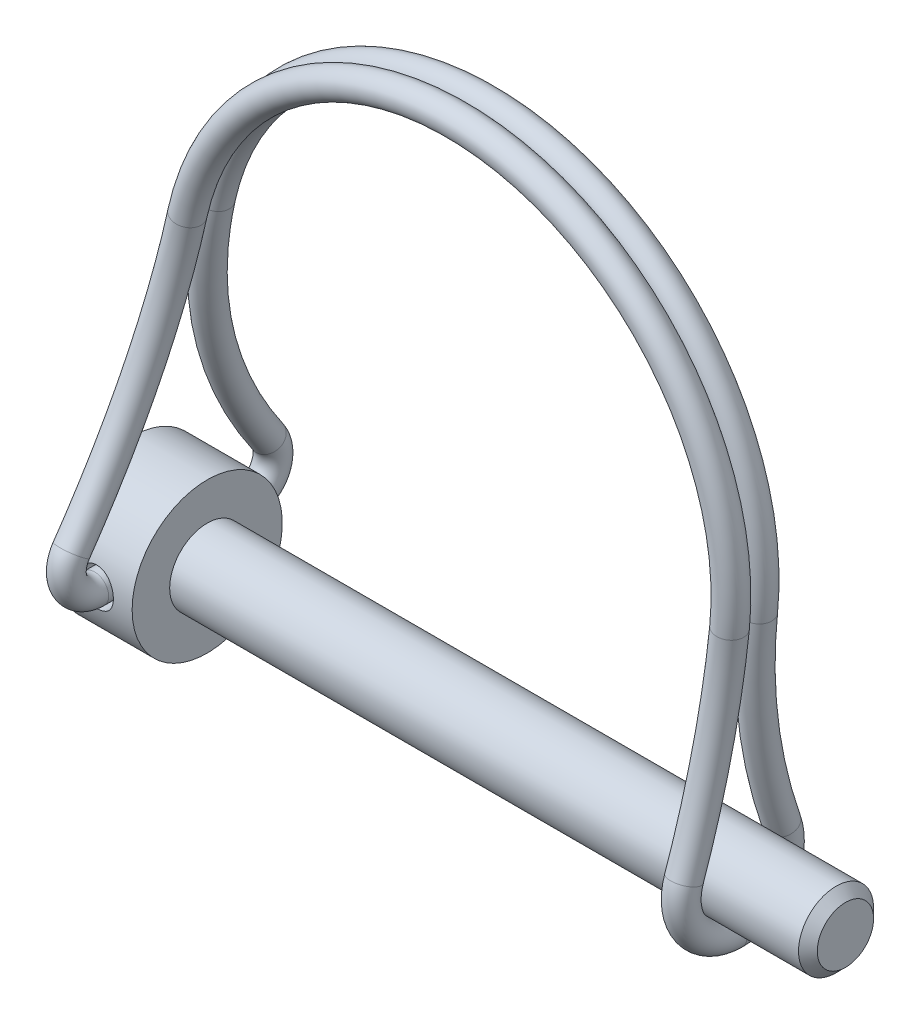
ISO-10303-21;
HEADER;
FILE_DESCRIPTION(('STEP AP214'),'2;1');
FILE_NAME('part.step','',(''),(''),'','','');
FILE_SCHEMA(('AUTOMOTIVE_DESIGN { 1 0 10303 214 1 1 1 1 }'));
ENDSEC;
DATA;
#1=APPLICATION_CONTEXT('core data for automotive mechanical design processes');
#2=APPLICATION_PROTOCOL_DEFINITION('international standard','automotive_design',2000,#1);
#3=PRODUCT_CONTEXT('',#1,'mechanical');
#4=PRODUCT('Part','Part','',(#3));
#5=PRODUCT_RELATED_PRODUCT_CATEGORY('part','',(#4));
#6=PRODUCT_DEFINITION_FORMATION('','',#4);
#7=PRODUCT_DEFINITION_CONTEXT('part definition',#1,'design');
#8=PRODUCT_DEFINITION('design','',#6,#7);
#9=PRODUCT_DEFINITION_SHAPE('','',#8);
#10=(LENGTH_UNIT() NAMED_UNIT(*) SI_UNIT(.MILLI.,.METRE.));
#11=(NAMED_UNIT(*) PLANE_ANGLE_UNIT() SI_UNIT($,.RADIAN.));
#12=(NAMED_UNIT(*) SI_UNIT($,.STERADIAN.) SOLID_ANGLE_UNIT());
#13=UNCERTAINTY_MEASURE_WITH_UNIT(LENGTH_MEASURE(1.E-05),#10,'distance_accuracy_value','');
#14=(GEOMETRIC_REPRESENTATION_CONTEXT(3) GLOBAL_UNCERTAINTY_ASSIGNED_CONTEXT((#13)) GLOBAL_UNIT_ASSIGNED_CONTEXT((#10,
#11,#12)) REPRESENTATION_CONTEXT('',''));
#15=CARTESIAN_POINT('',(0.,0.,0.));
#16=DIRECTION('',(0.,0.,1.));
#17=DIRECTION('',(1.,0.,0.));
#18=AXIS2_PLACEMENT_3D('',#15,#16,#17);
#19=CARTESIAN_POINT('',(50.8,0.,0.));
#20=DIRECTION('',(1.,0.,0.));
#21=DIRECTION('',(0.,0.,1.));
#22=AXIS2_PLACEMENT_3D('',#19,#20,#21);
#23=TOROIDAL_SURFACE('',#22,4.36562499999999,1.190625);
#24=CARTESIAN_POINT('',(50.8,-4.36562499999999,0.));
#25=DIRECTION('',(0.,0.,-1.));
#26=DIRECTION('',(-0.996347455698327,-0.0853917298306528,0.));
#27=AXIS2_PLACEMENT_3D('',#24,#25,#26);
#28=CIRCLE('',#27,1.190625);
#29=CARTESIAN_POINT('',(50.8,-5.55624999999999,0.));
#30=VERTEX_POINT('',#29);
#31=EDGE_CURVE('E11',#30,#30,#28,.T.);
#32=CARTESIAN_POINT('',(50.8,1.43033233820924,-4.12466132462991));
#33=DIRECTION('',(0.,0.944804312012578,0.327635181264832));
#34=DIRECTION('',(-0.996347455698327,0.0279773348815834,-0.0806784745542138));
#35=AXIS2_PLACEMENT_3D('',#32,#33,#34);
#36=CIRCLE('',#35,1.190625);
#37=CARTESIAN_POINT('',(50.8,1.82042297590267,-5.24956895861989));
#38=VERTEX_POINT('',#37);
#39=EDGE_CURVE('E48',#38,#38,#36,.T.);
#40=CARTESIAN_POINT('',(50.8,0.,0.));
#41=DIRECTION('',(1.,0.,0.));
#42=DIRECTION('',(0.,0.,1.));
#43=AXIS2_PLACEMENT_3D('',#40,#41,#42);
#44=CIRCLE('',#43,5.55624999999999);
#45=EDGE_CURVE('',#30,#38,#44,.T.);
#46=ORIENTED_EDGE('',*,*,#31,.T.);
#47=ORIENTED_EDGE('',*,*,#39,.F.);
#48=ORIENTED_EDGE('',*,*,#45,.T.);
#49=ORIENTED_EDGE('',*,*,#45,.F.);
#50=EDGE_LOOP('',(#46,#48,#47,#49));
#51=FACE_BOUND('',#50,.T.);
#52=ADVANCED_FACE('F42',(#51),#23,.T.);
#53=CARTESIAN_POINT('',(66.0000324491605,17.3339810536363,-49.9861461171416));
#54=DIRECTION('',(-0.95430598947787,0.0979076101876663,-0.282336994235618));
#55=DIRECTION('',(0.283700028650479,0.,-0.958913079347507));
#56=AXIS2_PLACEMENT_3D('',#53,#54,#55);
#57=TOROIDAL_SURFACE('',#56,50.8649468326962,1.190625);
#58=CARTESIAN_POINT('',(51.7139660018043,18.7996688312098,-1.19062499999999));
#59=DIRECTION('',(0.102059887315406,0.994778256397458,0.));
#60=DIRECTION('',(-0.992461773581279,0.101822226335518,-0.0682045614602101));
#61=AXIS2_PLACEMENT_3D('',#58,#59,#60);
#62=CIRCLE('',#61,1.190625);
#63=CARTESIAN_POINT('',(52.8983738633275,18.6781537778749,-1.19062499999999));
#64=VERTEX_POINT('',#63);
#65=EDGE_CURVE('E52',#64,#64,#62,.T.);
#66=ORIENTED_EDGE('',*,*,#65,.F.);
#67=EDGE_LOOP('',(#66));
#68=FACE_BOUND('',#67,.T.);
#69=ORIENTED_EDGE('',*,*,#39,.T.);
#70=EDGE_LOOP('',(#69));
#71=FACE_BOUND('',#70,.T.);
#72=ADVANCED_FACE('F89',(#68,#71),#57,.T.);
#73=CARTESIAN_POINT('',(28.575,21.1736252858788,-1.19062499999999));
#74=DIRECTION('',(0.,0.,1.));
#75=DIRECTION('',(-1.,0.,0.));
#76=AXIS2_PLACEMENT_3D('',#73,#74,#75);
#77=TOROIDAL_SURFACE('',#76,23.2604259823701,1.190625);
#78=CARTESIAN_POINT('',(5.85964491433834,26.1796277043385,-1.19062499999999));
#79=DIRECTION('',(-0.215215423064648,-0.976566598689052,0.));
#80=DIRECTION('',(0.974292524311,-0.214714263307587,-0.0682045614602101));
#81=AXIS2_PLACEMENT_3D('',#78,#79,#80);
#82=CIRCLE('',#81,1.190625);
#83=CARTESIAN_POINT('',(4.6969203077742,26.4358685674249,-1.19062499999999));
#84=VERTEX_POINT('',#83);
#85=EDGE_CURVE('E56',#84,#84,#82,.T.);
#86=CARTESIAN_POINT('',(28.575,21.1736252858788,-1.19062499999999));
#87=DIRECTION('',(0.,0.,1.));
#88=DIRECTION('',(-1.,0.,0.));
#89=AXIS2_PLACEMENT_3D('',#86,#87,#88);
#90=CIRCLE('',#89,24.4510509823701);
#91=EDGE_CURVE('',#64,#84,#90,.T.);
#92=ORIENTED_EDGE('',*,*,#65,.T.);
#93=ORIENTED_EDGE('',*,*,#85,.F.);
#94=ORIENTED_EDGE('',*,*,#91,.T.);
#95=ORIENTED_EDGE('',*,*,#91,.F.);
#96=EDGE_LOOP('',(#92,#94,#93,#95));
#97=FACE_BOUND('',#96,.T.);
#98=ADVANCED_FACE('F83',(#97),#77,.T.);
#99=CARTESIAN_POINT('',(16.7146795796366,23.7873987657186,-37.1127792874404));
#100=DIRECTION('',(0.932924154510997,-0.205597515694107,0.29560477579084));
#101=DIRECTION('',(-0.302057745950095,0.,0.953289629709433));
#102=AXIS2_PLACEMENT_3D('',#99,#100,#101);
#103=TOROIDAL_SURFACE('',#102,37.6026023770998,1.190625);
#104=CARTESIAN_POINT('',(3.175,3.75690670294242,-8.31326244888729));
#105=DIRECTION('',(0.,-0.820958042578213,-0.570988522061651));
#106=DIRECTION('',(1.,0.,0.));
#107=AXIS2_PLACEMENT_3D('',#104,#105,#106);
#108=CIRCLE('',#107,1.190625);
#109=CARTESIAN_POINT('',(3.175,4.43673991202207,-9.29071561833197));
#110=VERTEX_POINT('',#109);
#111=EDGE_CURVE('E61',#110,#110,#108,.T.);
#112=ORIENTED_EDGE('',*,*,#111,.F.);
#113=EDGE_LOOP('',(#112));
#114=FACE_BOUND('',#113,.T.);
#115=ORIENTED_EDGE('',*,*,#85,.T.);
#116=EDGE_LOOP('',(#115));
#117=FACE_BOUND('',#116,.T.);
#118=ADVANCED_FACE('F77',(#114,#117),#103,.T.);
#119=CARTESIAN_POINT('',(3.175,2.39142848606693,-6.35));
#120=DIRECTION('',(-1.,0.,0.));
#121=DIRECTION('',(0.,0.,-1.));
#122=AXIS2_PLACEMENT_3D('',#119,#120,#121);
#123=TOROIDAL_SURFACE('',#122,2.39142848606693,1.190625);
#124=CARTESIAN_POINT('',(3.175,0.,-6.35));
#125=DIRECTION('',(0.,0.,1.));
#126=DIRECTION('',(1.,0.,0.));
#127=AXIS2_PLACEMENT_3D('',#124,#125,#126);
#128=CIRCLE('',#127,1.190625);
#129=CARTESIAN_POINT('',(3.175,-1.190625,-6.35));
#130=VERTEX_POINT('',#129);
#131=EDGE_CURVE('E64',#130,#130,#128,.T.);
#132=CARTESIAN_POINT('',(3.175,2.39142848606693,-6.35));
#133=DIRECTION('',(-1.,0.,0.));
#134=DIRECTION('',(0.,0.,-1.));
#135=AXIS2_PLACEMENT_3D('',#132,#133,#134);
#136=CIRCLE('',#135,3.58205348606693);
#137=EDGE_CURVE('',#110,#130,#136,.T.);
#138=ORIENTED_EDGE('',*,*,#111,.T.);
#139=ORIENTED_EDGE('',*,*,#131,.F.);
#140=ORIENTED_EDGE('',*,*,#137,.T.);
#141=ORIENTED_EDGE('',*,*,#137,.F.);
#142=EDGE_LOOP('',(#138,#140,#139,#141));
#143=FACE_BOUND('',#142,.T.);
#144=ADVANCED_FACE('F74',(#143),#123,.T.);
#145=CARTESIAN_POINT('',(3.175,0.,-6.35));
#146=DIRECTION('',(0.,0.,1.));
#147=DIRECTION('',(0.,1.,0.));
#148=AXIS2_PLACEMENT_3D('',#145,#146,#147);
#149=CYLINDRICAL_SURFACE('',#148,1.190625);
#150=ORIENTED_EDGE('',*,*,#131,.T.);
#151=EDGE_LOOP('',(#150));
#152=FACE_BOUND('',#151,.T.);
#153=CARTESIAN_POINT('',(3.175,0.,0.));
#154=DIRECTION('',(0.,0.,1.));
#155=DIRECTION('',(1.,0.,0.));
#156=AXIS2_PLACEMENT_3D('',#153,#154,#155);
#157=CIRCLE('',#156,1.190625);
#158=CARTESIAN_POINT('',(4.365625,0.,0.));
#159=VERTEX_POINT('',#158);
#160=EDGE_CURVE('E65',#159,#159,#157,.T.);
#161=ORIENTED_EDGE('',*,*,#160,.F.);
#162=EDGE_LOOP('',(#161));
#163=FACE_BOUND('',#162,.T.);
#164=ADVANCED_FACE('F71',(#152,#163),#149,.T.);
#165=CARTESIAN_POINT('',(50.8,-4.36562499999998,0.));
#166=DIRECTION('',(0.,0.,1.));
#167=DIRECTION('',(-0.996347455698327,-0.0853917298306528,0.));
#168=AXIS2_PLACEMENT_3D('',#165,#166,#167);
#169=PLANE('',#168);
#170=ORIENTED_EDGE('',*,*,#31,.F.);
#171=EDGE_LOOP('',(#170));
#172=FACE_BOUND('',#171,.T.);
#173=ADVANCED_FACE('F101',(#172),#169,.T.);
#174=CARTESIAN_POINT('',(3.175,0.,0.));
#175=DIRECTION('',(0.,0.,-1.));
#176=DIRECTION('',(1.,0.,0.));
#177=AXIS2_PLACEMENT_3D('',#174,#175,#176);
#178=PLANE('',#177);
#179=ORIENTED_EDGE('',*,*,#160,.T.);
#180=EDGE_LOOP('',(#179));
#181=FACE_BOUND('',#180,.T.);
#182=ADVANCED_FACE('F102',(#181),#178,.F.);
#183=CLOSED_SHELL('',(#52,#72,#98,#118,#144,#164,#173,#182));
#184=MANIFOLD_SOLID_BREP('B2',#183);
#185=CARTESIAN_POINT('',(50.8,0.,0.));
#186=DIRECTION('',(1.,0.,0.));
#187=DIRECTION('',(0.,0.,-1.));
#188=AXIS2_PLACEMENT_3D('',#185,#186,#187);
#189=TOROIDAL_SURFACE('',#188,4.36562499999999,1.190625);
#190=CARTESIAN_POINT('',(50.8,1.43033233820924,4.12466132462991));
#191=DIRECTION('',(0.,-0.944804312012578,0.327635181264832));
#192=DIRECTION('',(-0.996347455698327,0.0279773348815834,0.0806784745542138));
#193=AXIS2_PLACEMENT_3D('',#190,#191,#192);
#194=CIRCLE('',#193,1.190625);
#195=CARTESIAN_POINT('',(50.8,1.82042297590267,5.24956895861989));
#196=VERTEX_POINT('',#195);
#197=EDGE_CURVE('E171',#196,#196,#194,.T.);
#198=CARTESIAN_POINT('',(50.8,-4.36562499999999,0.));
#199=DIRECTION('',(0.,0.,-1.));
#200=DIRECTION('',(-0.996347455698327,-0.0853917298306528,0.));
#201=AXIS2_PLACEMENT_3D('',#198,#199,#200);
#202=CIRCLE('',#201,1.190625);
#203=CARTESIAN_POINT('',(50.8,-5.55624999999999,0.));
#204=VERTEX_POINT('',#203);
#205=EDGE_CURVE('E41',#204,#204,#202,.T.);
#206=CARTESIAN_POINT('',(50.8,0.,0.));
#207=DIRECTION('',(1.,0.,0.));
#208=DIRECTION('',(0.,0.,-1.));
#209=AXIS2_PLACEMENT_3D('',#206,#207,#208);
#210=CIRCLE('',#209,5.55624999999999);
#211=EDGE_CURVE('',#196,#204,#210,.T.);
#212=ORIENTED_EDGE('',*,*,#197,.T.);
#213=ORIENTED_EDGE('',*,*,#205,.F.);
#214=ORIENTED_EDGE('',*,*,#211,.T.);
#215=ORIENTED_EDGE('',*,*,#211,.F.);
#216=EDGE_LOOP('',(#212,#214,#213,#215));
#217=FACE_BOUND('',#216,.T.);
#218=ADVANCED_FACE('F165',(#217),#189,.T.);
#219=CARTESIAN_POINT('',(66.0000324491605,17.3339810536363,49.9861461171416));
#220=DIRECTION('',(-0.95430598947787,0.0979076101876663,0.282336994235618));
#221=DIRECTION('',(0.283700028650479,0.,0.958913079347507));
#222=AXIS2_PLACEMENT_3D('',#219,#220,#221);
#223=TOROIDAL_SURFACE('',#222,50.8649468326962,1.190625);
#224=CARTESIAN_POINT('',(51.7139660018043,18.7996688312098,1.19062499999999));
#225=DIRECTION('',(-0.102059887315406,-0.994778256397458,0.));
#226=DIRECTION('',(-0.992461773581279,0.101822226335518,0.0682045614602101));
#227=AXIS2_PLACEMENT_3D('',#224,#225,#226);
#228=CIRCLE('',#227,1.190625);
#229=CARTESIAN_POINT('',(52.8983738633275,18.6781537778749,1.19062499999999));
#230=VERTEX_POINT('',#229);
#231=EDGE_CURVE('E175',#230,#230,#228,.T.);
#232=ORIENTED_EDGE('',*,*,#231,.T.);
#233=EDGE_LOOP('',(#232));
#234=FACE_BOUND('',#233,.T.);
#235=ORIENTED_EDGE('',*,*,#197,.F.);
#236=EDGE_LOOP('',(#235));
#237=FACE_BOUND('',#236,.T.);
#238=ADVANCED_FACE('F212',(#234,#237),#223,.T.);
#239=CARTESIAN_POINT('',(28.575,21.1736252858788,1.19062499999999));
#240=DIRECTION('',(0.,0.,-1.));
#241=DIRECTION('',(-1.,0.,0.));
#242=AXIS2_PLACEMENT_3D('',#239,#240,#241);
#243=TOROIDAL_SURFACE('',#242,23.2604259823701,1.190625);
#244=CARTESIAN_POINT('',(5.85964491433834,26.1796277043385,1.19062499999999));
#245=DIRECTION('',(0.215215423064648,0.976566598689052,0.));
#246=DIRECTION('',(0.974292524311,-0.214714263307587,0.0682045614602101));
#247=AXIS2_PLACEMENT_3D('',#244,#245,#246);
#248=CIRCLE('',#247,1.190625);
#249=CARTESIAN_POINT('',(4.6969203077742,26.4358685674249,1.19062499999999));
#250=VERTEX_POINT('',#249);
#251=EDGE_CURVE('E179',#250,#250,#248,.T.);
#252=CARTESIAN_POINT('',(28.575,21.1736252858788,1.19062499999999));
#253=DIRECTION('',(0.,0.,-1.));
#254=DIRECTION('',(-1.,0.,0.));
#255=AXIS2_PLACEMENT_3D('',#252,#253,#254);
#256=CIRCLE('',#255,24.4510509823701);
#257=EDGE_CURVE('',#250,#230,#256,.T.);
#258=ORIENTED_EDGE('',*,*,#251,.T.);
#259=ORIENTED_EDGE('',*,*,#231,.F.);
#260=ORIENTED_EDGE('',*,*,#257,.T.);
#261=ORIENTED_EDGE('',*,*,#257,.F.);
#262=EDGE_LOOP('',(#258,#260,#259,#261));
#263=FACE_BOUND('',#262,.T.);
#264=ADVANCED_FACE('F216',(#263),#243,.T.);
#265=CARTESIAN_POINT('',(16.7146795796366,23.7873987657186,37.1127792874404));
#266=DIRECTION('',(0.932924154510997,-0.205597515694107,-0.29560477579084));
#267=DIRECTION('',(-0.302057745950095,0.,-0.953289629709433));
#268=AXIS2_PLACEMENT_3D('',#265,#266,#267);
#269=TOROIDAL_SURFACE('',#268,37.6026023770998,1.190625);
#270=CARTESIAN_POINT('',(3.175,3.75690670294242,8.31326244888729));
#271=DIRECTION('',(0.,0.820958042578213,-0.570988522061651));
#272=DIRECTION('',(1.,0.,0.));
#273=AXIS2_PLACEMENT_3D('',#270,#271,#272);
#274=CIRCLE('',#273,1.190625);
#275=CARTESIAN_POINT('',(3.175,4.43673991202207,9.29071561833197));
#276=VERTEX_POINT('',#275);
#277=EDGE_CURVE('E184',#276,#276,#274,.T.);
#278=ORIENTED_EDGE('',*,*,#277,.T.);
#279=EDGE_LOOP('',(#278));
#280=FACE_BOUND('',#279,.T.);
#281=ORIENTED_EDGE('',*,*,#251,.F.);
#282=EDGE_LOOP('',(#281));
#283=FACE_BOUND('',#282,.T.);
#284=ADVANCED_FACE('F222',(#280,#283),#269,.T.);
#285=CARTESIAN_POINT('',(3.175,2.39142848606693,6.35));
#286=DIRECTION('',(-1.,0.,0.));
#287=DIRECTION('',(0.,0.,1.));
#288=AXIS2_PLACEMENT_3D('',#285,#286,#287);
#289=TOROIDAL_SURFACE('',#288,2.39142848606693,1.190625);
#290=CARTESIAN_POINT('',(3.175,0.,6.35));
#291=DIRECTION('',(0.,0.,1.));
#292=DIRECTION('',(1.,0.,0.));
#293=AXIS2_PLACEMENT_3D('',#290,#291,#292);
#294=CIRCLE('',#293,1.190625);
#295=CARTESIAN_POINT('',(3.175,-1.190625,6.35));
#296=VERTEX_POINT('',#295);
#297=EDGE_CURVE('E187',#296,#296,#294,.T.);
#298=CARTESIAN_POINT('',(3.175,2.39142848606693,6.35));
#299=DIRECTION('',(-1.,0.,0.));
#300=DIRECTION('',(0.,0.,1.));
#301=AXIS2_PLACEMENT_3D('',#298,#299,#300);
#302=CIRCLE('',#301,3.58205348606693);
#303=EDGE_CURVE('',#296,#276,#302,.T.);
#304=ORIENTED_EDGE('',*,*,#297,.T.);
#305=ORIENTED_EDGE('',*,*,#277,.F.);
#306=ORIENTED_EDGE('',*,*,#303,.T.);
#307=ORIENTED_EDGE('',*,*,#303,.F.);
#308=EDGE_LOOP('',(#304,#306,#305,#307));
#309=FACE_BOUND('',#308,.T.);
#310=ADVANCED_FACE('F194',(#309),#289,.T.);
#311=CARTESIAN_POINT('',(3.175,0.,6.35));
#312=DIRECTION('',(0.,0.,-1.));
#313=DIRECTION('',(0.,1.,0.));
#314=AXIS2_PLACEMENT_3D('',#311,#312,#313);
#315=CYLINDRICAL_SURFACE('',#314,1.190625);
#316=ORIENTED_EDGE('',*,*,#297,.F.);
#317=EDGE_LOOP('',(#316));
#318=FACE_BOUND('',#317,.T.);
#319=CARTESIAN_POINT('',(3.175,0.,0.));
#320=DIRECTION('',(0.,0.,1.));
#321=DIRECTION('',(1.,0.,0.));
#322=AXIS2_PLACEMENT_3D('',#319,#320,#321);
#323=CIRCLE('',#322,1.190625);
#324=CARTESIAN_POINT('',(4.365625,0.,0.));
#325=VERTEX_POINT('',#324);
#326=EDGE_CURVE('E188',#325,#325,#323,.T.);
#327=ORIENTED_EDGE('',*,*,#326,.T.);
#328=EDGE_LOOP('',(#327));
#329=FACE_BOUND('',#328,.T.);
#330=ADVANCED_FACE('F197',(#318,#329),#315,.T.);
#331=CARTESIAN_POINT('',(50.8,-4.36562499999998,0.));
#332=DIRECTION('',(0.,0.,-1.));
#333=DIRECTION('',(-0.996347455698327,-0.0853917298306528,0.));
#334=AXIS2_PLACEMENT_3D('',#331,#332,#333);
#335=PLANE('',#334);
#336=ORIENTED_EDGE('',*,*,#205,.T.);
#337=EDGE_LOOP('',(#336));
#338=FACE_BOUND('',#337,.T.);
#339=ADVANCED_FACE('F200',(#338),#335,.T.);
#340=CARTESIAN_POINT('',(3.175,0.,0.));
#341=DIRECTION('',(0.,0.,1.));
#342=DIRECTION('',(1.,0.,0.));
#343=AXIS2_PLACEMENT_3D('',#340,#341,#342);
#344=PLANE('',#343);
#345=ORIENTED_EDGE('',*,*,#326,.F.);
#346=EDGE_LOOP('',(#345));
#347=FACE_BOUND('',#346,.T.);
#348=ADVANCED_FACE('F204',(#347),#344,.F.);
#349=CLOSED_SHELL('',(#218,#238,#264,#284,#310,#330,#339,#348));
#350=MANIFOLD_SOLID_BREP('B6',#349);
#351=CARTESIAN_POINT('',(0.,0.,0.));
#352=DIRECTION('',(1.,0.,0.));
#353=DIRECTION('',(0.,0.,-1.));
#354=AXIS2_PLACEMENT_3D('',#351,#352,#353);
#355=PLANE('',#354);
#356=CARTESIAN_POINT('',(0.,0.,0.));
#357=DIRECTION('',(-1.,0.,0.));
#358=DIRECTION('',(0.,0.,1.));
#359=AXIS2_PLACEMENT_3D('',#356,#357,#358);
#360=CIRCLE('',#359,6.35);
#361=CARTESIAN_POINT('',(0.,0.,6.35));
#362=VERTEX_POINT('',#361);
#363=EDGE_CURVE('E335',#362,#362,#360,.T.);
#364=ORIENTED_EDGE('',*,*,#363,.T.);
#365=EDGE_LOOP('',(#364));
#366=FACE_BOUND('',#365,.T.);
#367=ADVANCED_FACE('F281',(#366),#355,.F.);
#368=CARTESIAN_POINT('',(0.,0.,0.));
#369=DIRECTION('',(-1.,0.,0.));
#370=DIRECTION('',(0.,0.,1.));
#371=AXIS2_PLACEMENT_3D('',#368,#369,#370);
#372=CYLINDRICAL_SURFACE('',#371,6.35);
#373=CARTESIAN_POINT('',(4.7625,0.,-6.35));
#374=CARTESIAN_POINT('',(4.76249753859378,0.087710527175469,-6.34999851693647));
#375=CARTESIAN_POINT('',(4.75520644209774,0.175448550370895,-6.34816461856185));
#376=CARTESIAN_POINT('',(4.72627838153342,0.348410025990484,-6.34102653803302));
#377=CARTESIAN_POINT('',(4.70463328657245,0.433632024604869,-6.335720389028));
#378=CARTESIAN_POINT('',(4.64773512341929,0.599038756393231,-6.32222537868075));
#379=CARTESIAN_POINT('',(4.61249839635967,0.679229404630091,-6.31403998007875));
#380=CARTESIAN_POINT('',(4.52947469553589,0.832561339598855,-6.29565822196369));
#381=CARTESIAN_POINT('',(4.48168729844079,0.905702388435774,-6.28546179462203));
#382=CARTESIAN_POINT('',(4.37387916428263,1.04436537306014,-6.2639301271799));
#383=CARTESIAN_POINT('',(4.3136485831682,1.10972143864797,-6.25257731732197));
#384=CARTESIAN_POINT('',(4.18311308313806,1.2295176146235,-6.23012914624385));
#385=CARTESIAN_POINT('',(4.11280702821496,1.28395649243784,-6.21903381421835));
#386=CARTESIAN_POINT('',(3.96282838503621,1.38115309112898,-6.1981797094886));
#387=CARTESIAN_POINT('',(3.88303216405899,1.42372526185434,-6.18844324148057));
#388=CARTESIAN_POINT('',(3.7171329309949,1.49478672821598,-6.17166548676269));
#389=CARTESIAN_POINT('',(3.63103092973024,1.52327827533996,-6.16462376920368));
#390=CARTESIAN_POINT('',(3.45678813106905,1.56480386895121,-6.15421337859408));
#391=CARTESIAN_POINT('',(3.36872273501396,1.57813615065279,-6.15077394721492));
#392=CARTESIAN_POINT('',(3.1915432644602,1.58989371194681,-6.14774575352442));
#393=CARTESIAN_POINT('',(3.1024293629273,1.58832141675736,-6.14815636474814));
#394=CARTESIAN_POINT('',(2.92796827013709,1.57055240524324,-6.15271825817254));
#395=CARTESIAN_POINT('',(2.84258213394944,1.55471107670164,-6.15677863343655));
#396=CARTESIAN_POINT('',(2.67571955445222,1.50942059780579,-6.16803767740945));
#397=CARTESIAN_POINT('',(2.59424339012766,1.47997047802348,-6.17523656968987));
#398=CARTESIAN_POINT('',(2.43656059946656,1.40799553081683,-6.19204495548597));
#399=CARTESIAN_POINT('',(2.36041546818939,1.3653417228215,-6.20167804905137));
#400=CARTESIAN_POINT('',(2.21623603217401,1.26826039211583,-6.22225610645758));
#401=CARTESIAN_POINT('',(2.14820314996215,1.21383080915602,-6.23320129970928));
#402=CARTESIAN_POINT('',(2.02014284005676,1.09290212445429,-6.25555306904602));
#403=CARTESIAN_POINT('',(1.9603989980184,1.02610312322554,-6.2669639019752));
#404=CARTESIAN_POINT('',(1.85290751839237,0.883297612691419,-6.28867980237548));
#405=CARTESIAN_POINT('',(1.80516024723773,0.807290822240911,-6.29898483606464));
#406=CARTESIAN_POINT('',(1.72291312957919,0.647822648854476,-6.3173793313301));
#407=CARTESIAN_POINT('',(1.68845934823073,0.564336557812463,-6.32546106135176));
#408=CARTESIAN_POINT('',(1.6341541847907,0.392510441951221,-6.33844212149251));
#409=CARTESIAN_POINT('',(1.61430000945747,0.304171349100933,-6.34334206034072));
#410=CARTESIAN_POINT('',(1.5901907431169,0.127571468662782,-6.34931736728871));
#411=CARTESIAN_POINT('',(1.58554946407031,0.0393665286541918,-6.35048739962928));
#412=CARTESIAN_POINT('',(1.59093852717539,-0.136559792498259,-6.34914068428627));
#413=CARTESIAN_POINT('',(1.60096754862908,-0.224281216457193,-6.34662426847621));
#414=CARTESIAN_POINT('',(1.63509421138088,-0.395408434455117,-6.33824806693119));
#415=CARTESIAN_POINT('',(1.65898117051314,-0.478858917575262,-6.3324383784665));
#416=CARTESIAN_POINT('',(1.71990499726344,-0.640563967845571,-6.31813047854458));
#417=CARTESIAN_POINT('',(1.75694319289811,-0.718818009309535,-6.30963199558136));
#418=CARTESIAN_POINT('',(1.84386656972575,-0.869445317271585,-6.29066250888679));
#419=CARTESIAN_POINT('',(1.89396805228657,-0.941689592609584,-6.28015917963337));
#420=CARTESIAN_POINT('',(2.00531932014346,-1.07688233277243,-6.25839605556685));
#421=CARTESIAN_POINT('',(2.06657102942789,-1.1398291899131,-6.24713613041388));
#422=CARTESIAN_POINT('',(2.20027707522706,-1.25623168454364,-6.22478812783483));
#423=CARTESIAN_POINT('',(2.27296948567756,-1.30941642656665,-6.21371105264873));
#424=CARTESIAN_POINT('',(2.42647537147622,-1.4028322199551,-6.19329129615911));
#425=CARTESIAN_POINT('',(2.50728848613241,-1.44306384631715,-6.18394853787603));
#426=CARTESIAN_POINT('',(2.67430855622051,-1.50913192014483,-6.16815816927521));
#427=CARTESIAN_POINT('',(2.76048007333074,-1.53505365312555,-6.16169345183933));
#428=CARTESIAN_POINT('',(2.93614436676597,-1.57199082345108,-6.15237470828778));
#429=CARTESIAN_POINT('',(3.02563641234272,-1.58300952074824,-6.14951989253599));
#430=CARTESIAN_POINT('',(3.20264475024676,-1.58965750810347,-6.14780437107521));
#431=CARTESIAN_POINT('',(3.29014395217367,-1.58571977515062,-6.14883128804079));
#432=CARTESIAN_POINT('',(3.46318828217361,-1.56355761954778,-6.15450370366634));
#433=CARTESIAN_POINT('',(3.54873344948111,-1.54533348401016,-6.15914912960548));
#434=CARTESIAN_POINT('',(3.71497061917756,-1.49535231307695,-6.17147250889215));
#435=CARTESIAN_POINT('',(3.79568848137922,-1.46367648662006,-6.17913224458427));
#436=CARTESIAN_POINT('',(3.95072169670532,-1.3877553668987,-6.19662374808777));
#437=CARTESIAN_POINT('',(4.02503615995615,-1.34350833028618,-6.20645581711151));
#438=CARTESIAN_POINT('',(4.16724531569381,-1.24234336730763,-6.22750462928884));
#439=CARTESIAN_POINT('',(4.23492196937369,-1.18512501408213,-6.23875080280276));
#440=CARTESIAN_POINT('',(4.35985395574181,-1.06022708450913,-6.26118495502319));
#441=CARTESIAN_POINT('',(4.41710681020289,-0.992545027501376,-6.27237291927805));
#442=CARTESIAN_POINT('',(4.52057696823088,-0.847161529260238,-6.29367185560443));
#443=CARTESIAN_POINT('',(4.56657563280242,-0.76930083028484,-6.3037596531221));
#444=CARTESIAN_POINT('',(4.64475773161206,-0.606706579648584,-6.32147712265334));
#445=CARTESIAN_POINT('',(4.6769510650197,-0.521978004637212,-6.32910855503102));
#446=CARTESIAN_POINT('',(4.72183018709888,-0.364500851349337,-6.33992529706865));
#447=CARTESIAN_POINT('',(4.73704839889822,-0.292502347544369,-6.34367735847431));
#448=CARTESIAN_POINT('',(4.75738395699989,-0.14700892570923,-6.34871523870479));
#449=CARTESIAN_POINT('',(4.76250206301478,-0.073514120648432,-6.35000124302196));
#450=CARTESIAN_POINT('',(4.7625,0.,-6.35));
#451=B_SPLINE_CURVE_WITH_KNOTS('',3,(#373,#374,#375,#376,#377,#378,#379,#380,#381,#382,#383,
#384,#385,#386,#387,#388,#389,#390,#391,#392,#393,#394,#395,#396,#397,#398,#399,#400,#401,#402,
#403,#404,#405,#406,#407,#408,#409,#410,#411,#412,#413,#414,#415,#416,#417,#418,#419,#420,#421,
#422,#423,#424,#425,#426,#427,#428,#429,#430,#431,#432,#433,#434,#435,#436,#437,#438,#439,#440,
#441,#442,#443,#444,#445,#446,#447,#448,#449,#450),.UNSPECIFIED.,.T.,.F.,(4,2,2,2,2,2,2,2,2,2,2,
2,2,2,2,2,2,2,2,2,2,2,2,2,2,2,2,2,2,2,2,2,2,2,2,2,2,2,4),(0.,0.26286217903275,0.525873384966794,
0.788569354919463,1.05127418667921,1.31883610837639,1.58642822138899,1.85799568652646,
2.12951971404248,2.39560412313564,2.66164523669271,2.92123809332428,3.18084944501557,
3.44308141999856,3.70535931134939,3.97511588525546,4.24488069782478,4.51557209034646,
4.78621167987147,5.04992543637984,5.3136154534432,5.57339790527356,5.83320659749424,
6.09762546839998,6.36209000850154,6.63304605574737,6.90399007343229,7.17330136133189,
7.44255372942132,7.70407167588532,7.9655843667847,8.22554023925415,8.48553217944887,
8.75230635033822,9.01914386340359,9.29081396320397,9.56228893377595,9.78262207113774,
10.0029386347888),.UNSPECIFIED.);
#452=CARTESIAN_POINT('',(4.7625,0.,-6.35));
#453=VERTEX_POINT('',#452);
#454=EDGE_CURVE('E292',#453,#453,#451,.T.);
#455=ORIENTED_EDGE('',*,*,#454,.T.);
#456=EDGE_LOOP('',(#455));
#457=FACE_BOUND('',#456,.T.);
#458=CARTESIAN_POINT('',(4.7625,0.,6.35));
#459=CARTESIAN_POINT('',(4.76249753859378,-0.0877105271754655,6.34999851693647));
#460=CARTESIAN_POINT('',(4.75520644209774,-0.175448550370891,6.34816461856185));
#461=CARTESIAN_POINT('',(4.72627838153342,-0.34841002599048,6.34102653803302));
#462=CARTESIAN_POINT('',(4.70463328657244,-0.433632024604866,6.335720389028));
#463=CARTESIAN_POINT('',(4.64773512341929,-0.599038756393227,6.32222537868075));
#464=CARTESIAN_POINT('',(4.61249839635966,-0.679229404630087,6.31403998007875));
#465=CARTESIAN_POINT('',(4.52947469553588,-0.832561339598851,6.29565822196369));
#466=CARTESIAN_POINT('',(4.48168729844079,-0.90570238843577,6.28546179462203));
#467=CARTESIAN_POINT('',(4.37387916428262,-1.04436537306014,6.2639301271799));
#468=CARTESIAN_POINT('',(4.3136485831682,-1.10972143864797,6.25257731732197));
#469=CARTESIAN_POINT('',(4.18311308313806,-1.2295176146235,6.23012914624385));
#470=CARTESIAN_POINT('',(4.11280702821495,-1.28395649243783,6.21903381421835));
#471=CARTESIAN_POINT('',(3.96282838503621,-1.38115309112897,6.1981797094886));
#472=CARTESIAN_POINT('',(3.88303216405899,-1.42372526185433,6.18844324148057));
#473=CARTESIAN_POINT('',(3.7171329309949,-1.49478672821597,6.17166548676269));
#474=CARTESIAN_POINT('',(3.63103092973023,-1.52327827533996,6.16462376920368));
#475=CARTESIAN_POINT('',(3.45678813106905,-1.5648038689512,6.15421337859408));
#476=CARTESIAN_POINT('',(3.36872273501396,-1.57813615065278,6.15077394721492));
#477=CARTESIAN_POINT('',(3.1915432644602,-1.58989371194681,6.14774575352442));
#478=CARTESIAN_POINT('',(3.1024293629273,-1.58832141675736,6.14815636474815));
#479=CARTESIAN_POINT('',(2.92796827013709,-1.57055240524324,6.15271825817254));
#480=CARTESIAN_POINT('',(2.84258213394944,-1.55471107670163,6.15677863343656));
#481=CARTESIAN_POINT('',(2.67571955445221,-1.50942059780578,6.16803767740945));
#482=CARTESIAN_POINT('',(2.59424339012766,-1.47997047802347,6.17523656968987));
#483=CARTESIAN_POINT('',(2.43656059946656,-1.40799553081682,6.19204495548598));
#484=CARTESIAN_POINT('',(2.36041546818939,-1.36534172282149,6.20167804905137));
#485=CARTESIAN_POINT('',(2.21623603217401,-1.26826039211582,6.22225610645758));
#486=CARTESIAN_POINT('',(2.14820314996215,-1.21383080915602,6.23320129970928));
#487=CARTESIAN_POINT('',(2.02014284005676,-1.09290212445428,6.25555306904602));
#488=CARTESIAN_POINT('',(1.9603989980184,-1.02610312322553,6.2669639019752));
#489=CARTESIAN_POINT('',(1.85290751839237,-0.883297612691409,6.28867980237548));
#490=CARTESIAN_POINT('',(1.80516024723772,-0.807290822240901,6.29898483606464));
#491=CARTESIAN_POINT('',(1.72291312957919,-0.647822648854466,6.3173793313301));
#492=CARTESIAN_POINT('',(1.68845934823073,-0.564336557812453,6.32546106135176));
#493=CARTESIAN_POINT('',(1.6341541847907,-0.392510441951211,6.33844212149251));
#494=CARTESIAN_POINT('',(1.61430000945747,-0.304171349100923,6.34334206034072));
#495=CARTESIAN_POINT('',(1.5901907431169,-0.127571468662771,6.34931736728871));
#496=CARTESIAN_POINT('',(1.58554946407031,-0.0393665286541817,6.35048739962928));
#497=CARTESIAN_POINT('',(1.59093852717539,0.13655979249827,6.34914068428627));
#498=CARTESIAN_POINT('',(1.60096754862908,0.224281216457203,6.34662426847621));
#499=CARTESIAN_POINT('',(1.63509421138088,0.395408434455127,6.33824806693119));
#500=CARTESIAN_POINT('',(1.65898117051315,0.478858917575272,6.3324383784665));
#501=CARTESIAN_POINT('',(1.71990499726344,0.640563967845581,6.31813047854458));
#502=CARTESIAN_POINT('',(1.75694319289811,0.718818009309544,6.30963199558136));
#503=CARTESIAN_POINT('',(1.84386656972576,0.869445317271594,6.29066250888678));
#504=CARTESIAN_POINT('',(1.89396805228658,0.941689592609593,6.28015917963336));
#505=CARTESIAN_POINT('',(2.00531932014346,1.07688233277244,6.25839605556685));
#506=CARTESIAN_POINT('',(2.0665710294279,1.13982918991311,6.24713613041387));
#507=CARTESIAN_POINT('',(2.20027707522706,1.25623168454365,6.22478812783483));
#508=CARTESIAN_POINT('',(2.27296948567757,1.30941642656666,6.21371105264872));
#509=CARTESIAN_POINT('',(2.42647537147622,1.40283221995511,6.19329129615911));
#510=CARTESIAN_POINT('',(2.50728848613241,1.44306384631715,6.18394853787602));
#511=CARTESIAN_POINT('',(2.67430855622051,1.50913192014484,6.1681581692752));
#512=CARTESIAN_POINT('',(2.76048007333075,1.53505365312556,6.16169345183933));
#513=CARTESIAN_POINT('',(2.93614436676598,1.57199082345109,6.15237470828777));
#514=CARTESIAN_POINT('',(3.02563641234272,1.58300952074825,6.14951989253599));
#515=CARTESIAN_POINT('',(3.20264475024676,1.58965750810348,6.14780437107521));
#516=CARTESIAN_POINT('',(3.29014395217368,1.58571977515063,6.14883128804079));
#517=CARTESIAN_POINT('',(3.46318828217362,1.56355761954779,6.15450370366633));
#518=CARTESIAN_POINT('',(3.54873344948112,1.54533348401017,6.15914912960548));
#519=CARTESIAN_POINT('',(3.71497061917756,1.49535231307696,6.17147250889214));
#520=CARTESIAN_POINT('',(3.79568848137922,1.46367648662007,6.17913224458427));
#521=CARTESIAN_POINT('',(3.95072169670532,1.3877553668987,6.19662374808777));
#522=CARTESIAN_POINT('',(4.02503615995616,1.34350833028619,6.20645581711151));
#523=CARTESIAN_POINT('',(4.16724531569381,1.24234336730764,6.22750462928884));
#524=CARTESIAN_POINT('',(4.23492196937369,1.18512501408214,6.23875080280276));
#525=CARTESIAN_POINT('',(4.35985395574181,1.06022708450914,6.26118495502319));
#526=CARTESIAN_POINT('',(4.4171068102029,0.99254502750138,6.27237291927805));
#527=CARTESIAN_POINT('',(4.52057696823088,0.847161529260242,6.29367185560443));
#528=CARTESIAN_POINT('',(4.56657563280242,0.769300830284843,6.3037596531221));
#529=CARTESIAN_POINT('',(4.64475773161206,0.606706579648588,6.32147712265334));
#530=CARTESIAN_POINT('',(4.6769510650197,0.521978004637217,6.32910855503102));
#531=CARTESIAN_POINT('',(4.72183018709888,0.364500851349342,6.33992529706865));
#532=CARTESIAN_POINT('',(4.73704839889822,0.292502347544374,6.34367735847431));
#533=CARTESIAN_POINT('',(4.75738395699989,0.147008925709234,6.34871523870479));
#534=CARTESIAN_POINT('',(4.76250206301478,0.073514120648436,6.35000124302196));
#535=CARTESIAN_POINT('',(4.7625,0.,6.35));
#536=B_SPLINE_CURVE_WITH_KNOTS('',3,(#458,#459,#460,#461,#462,#463,#464,#465,#466,#467,#468,
#469,#470,#471,#472,#473,#474,#475,#476,#477,#478,#479,#480,#481,#482,#483,#484,#485,#486,#487,
#488,#489,#490,#491,#492,#493,#494,#495,#496,#497,#498,#499,#500,#501,#502,#503,#504,#505,#506,
#507,#508,#509,#510,#511,#512,#513,#514,#515,#516,#517,#518,#519,#520,#521,#522,#523,#524,#525,
#526,#527,#528,#529,#530,#531,#532,#533,#534,#535),.UNSPECIFIED.,.T.,.F.,(4,2,2,2,2,2,2,2,2,2,2,
2,2,2,2,2,2,2,2,2,2,2,2,2,2,2,2,2,2,2,2,2,2,2,2,2,2,2,4),(0.,0.26286217903275,0.525873384966794,
0.788569354919462,1.05127418667921,1.31883610837639,1.58642822138899,1.85799568652646,
2.12951971404248,2.39560412313564,2.66164523669271,2.92123809332428,3.18084944501557,
3.44308141999856,3.70535931134939,3.97511588525546,4.24488069782478,4.51557209034646,
4.78621167987147,5.04992543637984,5.31361545344319,5.57339790527356,5.83320659749424,
6.09762546839997,6.36209000850153,6.63304605574737,6.90399007343229,7.17330136133188,
7.44255372942131,7.70407167588531,7.9655843667847,8.22554023925415,8.48553217944887,
8.75230635033822,9.01914386340359,9.29081396320397,9.56228893377595,9.78262207113774,
10.0029386347888),.UNSPECIFIED.);
#537=CARTESIAN_POINT('',(4.7625,0.,6.35));
#538=VERTEX_POINT('',#537);
#539=EDGE_CURVE('E296',#538,#538,#536,.T.);
#540=ORIENTED_EDGE('',*,*,#539,.T.);
#541=EDGE_LOOP('',(#540));
#542=FACE_BOUND('',#541,.T.);
#543=ORIENTED_EDGE('',*,*,#363,.F.);
#544=EDGE_LOOP('',(#543));
#545=FACE_BOUND('',#544,.T.);
#546=CARTESIAN_POINT('',(6.35,0.,0.));
#547=DIRECTION('',(-1.,0.,0.));
#548=DIRECTION('',(0.,0.,1.));
#549=AXIS2_PLACEMENT_3D('',#546,#547,#548);
#550=CIRCLE('',#549,6.35);
#551=CARTESIAN_POINT('',(6.35,0.,6.35));
#552=VERTEX_POINT('',#551);
#553=EDGE_CURVE('E337',#552,#552,#550,.T.);
#554=ORIENTED_EDGE('',*,*,#553,.T.);
#555=EDGE_LOOP('',(#554));
#556=FACE_BOUND('',#555,.T.);
#557=ADVANCED_FACE('F306',(#457,#542,#545,#556),#372,.T.);
#558=CARTESIAN_POINT('',(6.35,6.35,0.));
#559=DIRECTION('',(-1.,0.,0.));
#560=DIRECTION('',(0.,0.,1.));
#561=AXIS2_PLACEMENT_3D('',#558,#559,#560);
#562=PLANE('',#561);
#563=ORIENTED_EDGE('',*,*,#553,.F.);
#564=EDGE_LOOP('',(#563));
#565=FACE_BOUND('',#564,.T.);
#566=CARTESIAN_POINT('',(6.35,0.,0.));
#567=DIRECTION('',(-1.,0.,0.));
#568=DIRECTION('',(0.,0.,1.));
#569=AXIS2_PLACEMENT_3D('',#566,#567,#568);
#570=CIRCLE('',#569,3.175);
#571=CARTESIAN_POINT('',(6.35,0.,3.175));
#572=VERTEX_POINT('',#571);
#573=EDGE_CURVE('E340',#572,#572,#570,.T.);
#574=ORIENTED_EDGE('',*,*,#573,.T.);
#575=EDGE_LOOP('',(#574));
#576=FACE_BOUND('',#575,.T.);
#577=ADVANCED_FACE('F320',(#565,#576),#562,.F.);
#578=CARTESIAN_POINT('',(0.,0.,0.));
#579=DIRECTION('',(-1.,0.,0.));
#580=DIRECTION('',(0.,0.,1.));
#581=AXIS2_PLACEMENT_3D('',#578,#579,#580);
#582=CYLINDRICAL_SURFACE('',#581,3.175);
#583=CARTESIAN_POINT('',(59.53125,0.,0.));
#584=DIRECTION('',(-1.,0.,0.));
#585=DIRECTION('',(0.,0.,1.));
#586=AXIS2_PLACEMENT_3D('',#583,#584,#585);
#587=CIRCLE('',#586,3.175);
#588=CARTESIAN_POINT('',(59.53125,0.,3.175));
#589=VERTEX_POINT('',#588);
#590=EDGE_CURVE('E288',#589,#589,#587,.T.);
#591=ORIENTED_EDGE('',*,*,#590,.T.);
#592=EDGE_LOOP('',(#591));
#593=FACE_BOUND('',#592,.T.);
#594=ORIENTED_EDGE('',*,*,#573,.F.);
#595=EDGE_LOOP('',(#594));
#596=FACE_BOUND('',#595,.T.);
#597=ADVANCED_FACE('F318',(#593,#596),#582,.T.);
#598=CARTESIAN_POINT('',(60.325,3.175,0.));
#599=DIRECTION('',(-1.,0.,0.));
#600=DIRECTION('',(0.,0.,1.));
#601=AXIS2_PLACEMENT_3D('',#598,#599,#600);
#602=PLANE('',#601);
#603=CARTESIAN_POINT('',(60.325,0.,0.));
#604=DIRECTION('',(-1.,0.,0.));
#605=DIRECTION('',(0.,0.,1.));
#606=AXIS2_PLACEMENT_3D('',#603,#604,#605);
#607=CIRCLE('',#606,2.38125);
#608=CARTESIAN_POINT('',(60.325,0.,2.38125));
#609=VERTEX_POINT('',#608);
#610=EDGE_CURVE('E164',#609,#609,#607,.F.);
#611=ORIENTED_EDGE('',*,*,#610,.T.);
#612=EDGE_LOOP('',(#611));
#613=FACE_BOUND('',#612,.T.);
#614=ADVANCED_FACE('F313',(#613),#602,.F.);
#615=CARTESIAN_POINT('',(3.175,0.,-6.35));
#616=DIRECTION('',(0.,0.,1.));
#617=DIRECTION('',(1.,0.,0.));
#618=AXIS2_PLACEMENT_3D('',#615,#616,#617);
#619=CYLINDRICAL_SURFACE('',#618,1.5875);
#620=ORIENTED_EDGE('',*,*,#539,.F.);
#621=EDGE_LOOP('',(#620));
#622=FACE_BOUND('',#621,.T.);
#623=ORIENTED_EDGE('',*,*,#454,.F.);
#624=EDGE_LOOP('',(#623));
#625=FACE_BOUND('',#624,.T.);
#626=ADVANCED_FACE('F309',(#622,#625),#619,.F.);
#627=CARTESIAN_POINT('',(59.53125,0.,0.));
#628=DIRECTION('',(-1.,0.,0.));
#629=DIRECTION('',(0.,0.,1.));
#630=AXIS2_PLACEMENT_3D('',#627,#628,#629);
#631=CONICAL_SURFACE('',#630,3.175,0.785398163397446);
#632=CARTESIAN_POINT('',(60.325,0.,2.38125));
#633=CARTESIAN_POINT('',(60.3167317708333,0.,2.38951822916666));
#634=CARTESIAN_POINT('',(60.3084635416667,0.,2.39778645833333));
#635=CARTESIAN_POINT('',(60.2919270833333,0.,2.41432291666667));
#636=CARTESIAN_POINT('',(60.2836588541667,0.,2.42259114583333));
#637=CARTESIAN_POINT('',(60.2671223958333,0.,2.43912760416666));
#638=CARTESIAN_POINT('',(60.2588541666667,0.,2.44739583333333));
#639=CARTESIAN_POINT('',(60.2423177083333,0.,2.46393229166666));
#640=CARTESIAN_POINT('',(60.2340494791667,0.,2.47220052083333));
#641=CARTESIAN_POINT('',(60.2175130208333,0.,2.48873697916666));
#642=CARTESIAN_POINT('',(60.2092447916667,0.,2.49700520833333));
#643=CARTESIAN_POINT('',(60.1927083333333,0.,2.51354166666667));
#644=CARTESIAN_POINT('',(60.1844401041667,0.,2.52180989583333));
#645=CARTESIAN_POINT('',(60.1679036458333,0.,2.53834635416666));
#646=CARTESIAN_POINT('',(60.1596354166667,0.,2.54661458333333));
#647=CARTESIAN_POINT('',(60.1430989583333,0.,2.56315104166666));
#648=CARTESIAN_POINT('',(60.1348307291667,0.,2.57141927083333));
#649=CARTESIAN_POINT('',(60.1182942708333,0.,2.58795572916666));
#650=CARTESIAN_POINT('',(60.1100260416667,0.,2.59622395833333));
#651=CARTESIAN_POINT('',(60.0934895833333,0.,2.61276041666666));
#652=CARTESIAN_POINT('',(60.0852213541667,0.,2.62102864583333));
#653=CARTESIAN_POINT('',(60.0686848958333,0.,2.63756510416666));
#654=CARTESIAN_POINT('',(60.0604166666667,0.,2.64583333333333));
#655=CARTESIAN_POINT('',(60.0438802083333,0.,2.66236979166666));
#656=CARTESIAN_POINT('',(60.0356119791667,0.,2.67063802083333));
#657=CARTESIAN_POINT('',(60.0190755208333,0.,2.68717447916666));
#658=CARTESIAN_POINT('',(60.0108072916667,0.,2.69544270833333));
#659=CARTESIAN_POINT('',(59.9942708333333,0.,2.71197916666666));
#660=CARTESIAN_POINT('',(59.9860026041667,0.,2.72024739583333));
#661=CARTESIAN_POINT('',(59.9694661458333,0.,2.73678385416666));
#662=CARTESIAN_POINT('',(59.9611979166667,0.,2.74505208333333));
#663=CARTESIAN_POINT('',(59.9446614583333,0.,2.76158854166666));
#664=CARTESIAN_POINT('',(59.9363932291667,0.,2.76985677083333));
#665=CARTESIAN_POINT('',(59.9198567708333,0.,2.78639322916666));
#666=CARTESIAN_POINT('',(59.9115885416667,0.,2.79466145833333));
#667=CARTESIAN_POINT('',(59.8950520833333,0.,2.81119791666666));
#668=CARTESIAN_POINT('',(59.8867838541667,0.,2.81946614583333));
#669=CARTESIAN_POINT('',(59.8702473958333,0.,2.83600260416666));
#670=CARTESIAN_POINT('',(59.8619791666667,0.,2.84427083333333));
#671=CARTESIAN_POINT('',(59.8454427083333,0.,2.86080729166666));
#672=CARTESIAN_POINT('',(59.8371744791667,0.,2.86907552083333));
#673=CARTESIAN_POINT('',(59.8206380208333,0.,2.88561197916666));
#674=CARTESIAN_POINT('',(59.8123697916667,0.,2.89388020833333));
#675=CARTESIAN_POINT('',(59.7958333333333,0.,2.91041666666666));
#676=CARTESIAN_POINT('',(59.7875651041667,0.,2.91868489583333));
#677=CARTESIAN_POINT('',(59.7710286458333,0.,2.93522135416666));
#678=CARTESIAN_POINT('',(59.7627604166667,0.,2.94348958333333));
#679=CARTESIAN_POINT('',(59.7462239583333,0.,2.96002604166666));
#680=CARTESIAN_POINT('',(59.7379557291667,0.,2.96829427083333));
#681=CARTESIAN_POINT('',(59.7214192708333,0.,2.98483072916666));
#682=CARTESIAN_POINT('',(59.7131510416667,0.,2.99309895833333));
#683=CARTESIAN_POINT('',(59.6966145833333,0.,3.00963541666666));
#684=CARTESIAN_POINT('',(59.6883463541667,0.,3.01790364583333));
#685=CARTESIAN_POINT('',(59.6718098958333,0.,3.03444010416666));
#686=CARTESIAN_POINT('',(59.6635416666667,0.,3.04270833333333));
#687=CARTESIAN_POINT('',(59.6470052083333,0.,3.05924479166666));
#688=CARTESIAN_POINT('',(59.6387369791667,0.,3.06751302083333));
#689=CARTESIAN_POINT('',(59.6222005208333,0.,3.08404947916666));
#690=CARTESIAN_POINT('',(59.6139322916667,0.,3.09231770833333));
#691=CARTESIAN_POINT('',(59.5973958333333,0.,3.10885416666666));
#692=CARTESIAN_POINT('',(59.5891276041667,0.,3.11712239583333));
#693=CARTESIAN_POINT('',(59.5725911458333,0.,3.13365885416666));
#694=CARTESIAN_POINT('',(59.5643229166667,0.,3.14192708333333));
#695=CARTESIAN_POINT('',(59.5477864583333,0.,3.15846354166666));
#696=CARTESIAN_POINT('',(59.5395182291667,0.,3.16673177083333));
#697=CARTESIAN_POINT('',(59.53125,0.,3.175));
#698=B_SPLINE_CURVE_WITH_KNOTS('',3,(#632,#633,#634,#635,#636,#637,#638,#639,#640,#641,#642,
#643,#644,#645,#646,#647,#648,#649,#650,#651,#652,#653,#654,#655,#656,#657,#658,#659,#660,#661,
#662,#663,#664,#665,#666,#667,#668,#669,#670,#671,#672,#673,#674,#675,#676,#677,#678,#679,#680,
#681,#682,#683,#684,#685,#686,#687,#688,#689,#690,#691,#692,#693,#694,#695,#696,#697),
.UNSPECIFIED.,.F.,.F.,(4,2,2,2,2,2,2,2,2,2,2,2,2,2,2,2,2,2,2,2,2,2,2,2,2,2,2,2,2,2,2,2,4),(0.,
0.0350791254729247,0.0701582509458493,0.105237376418779,0.140316501891704,0.175395627364629,
0.210474752837558,0.245553878310483,0.280633003783408,0.315712129256337,0.350791254729262,
0.385870380202187,0.420949505675116,0.456028631148041,0.491107756620966,0.526186882093896,
0.56126600756682,0.596345133039745,0.631424258512674,0.666503383985599,0.701582509458524,
0.736661634931454,0.771740760404378,0.806819885877303,0.841899011350232,0.876978136823157,
0.912057262296082,0.947136387769012,0.982215513241936,1.01729463871486,1.05237376418779,
1.08745288966072,1.12253201513365),.UNSPECIFIED.);
#699=EDGE_CURVE('BSEAM283',#609,#589,#698,.T.);
#700=ORIENTED_EDGE('',*,*,#610,.F.);
#701=ORIENTED_EDGE('',*,*,#590,.F.);
#702=ORIENTED_EDGE('',*,*,#699,.T.);
#703=ORIENTED_EDGE('',*,*,#699,.F.);
#704=EDGE_LOOP('',(#700,#702,#701,#703));
#705=FACE_BOUND('',#704,.T.);
#706=ADVANCED_FACE('F283',(#705),#631,.T.);
#707=CLOSED_SHELL('',(#367,#557,#577,#597,#614,#626,#706));
#708=MANIFOLD_SOLID_BREP('B36',#707);
#709=ADVANCED_BREP_SHAPE_REPRESENTATION('',(#18,#184,#350,#708),#14);
#710=SHAPE_DEFINITION_REPRESENTATION(#9,#709);
ENDSEC;
END-ISO-10303-21;
